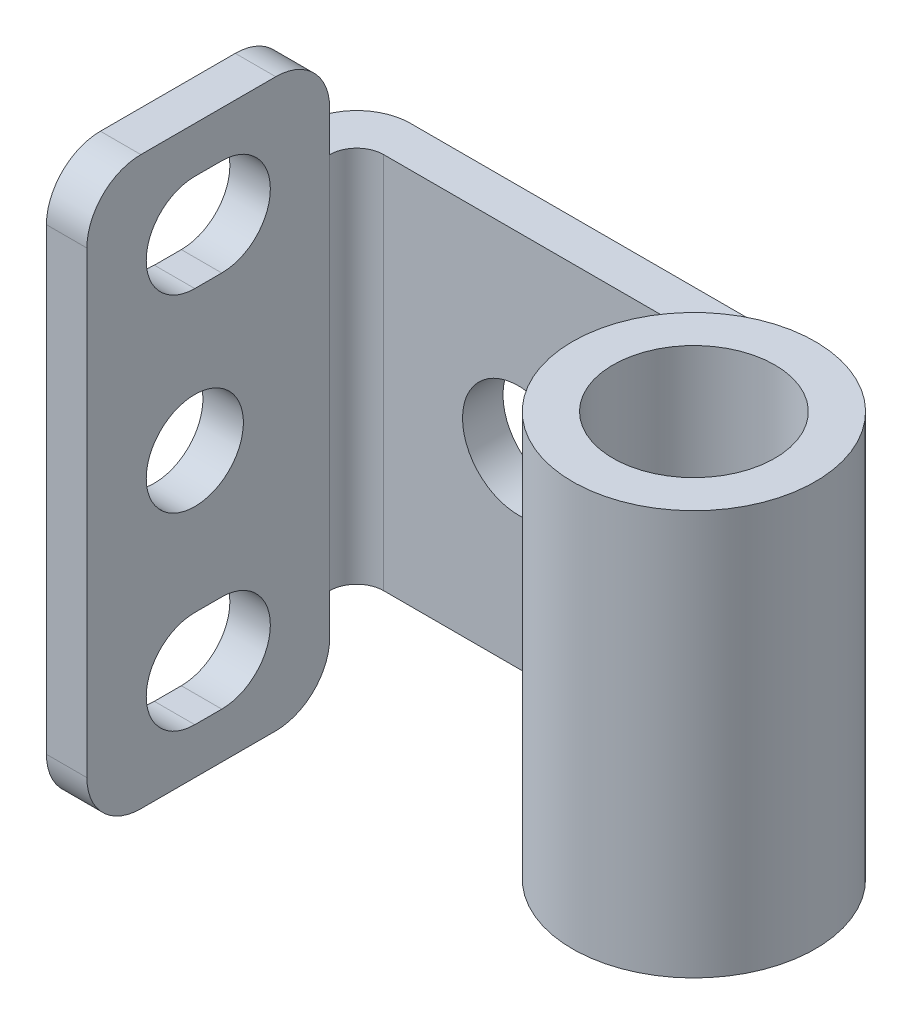
ISO-10303-21;
HEADER;
FILE_DESCRIPTION(('STEP AP214'),'2;1');
FILE_NAME('part.step','',(''),(''),'','','');
FILE_SCHEMA(('AUTOMOTIVE_DESIGN { 1 0 10303 214 1 1 1 1 }'));
ENDSEC;
DATA;
#1=APPLICATION_CONTEXT('core data for automotive mechanical design processes');
#2=APPLICATION_PROTOCOL_DEFINITION('international standard','automotive_design',2000,#1);
#3=PRODUCT_CONTEXT('',#1,'mechanical');
#4=PRODUCT('Part','Part','',(#3));
#5=PRODUCT_RELATED_PRODUCT_CATEGORY('part','',(#4));
#6=PRODUCT_DEFINITION_FORMATION('','',#4);
#7=PRODUCT_DEFINITION_CONTEXT('part definition',#1,'design');
#8=PRODUCT_DEFINITION('design','',#6,#7);
#9=PRODUCT_DEFINITION_SHAPE('','',#8);
#10=(LENGTH_UNIT() NAMED_UNIT(*) SI_UNIT(.MILLI.,.METRE.));
#11=(NAMED_UNIT(*) PLANE_ANGLE_UNIT() SI_UNIT($,.RADIAN.));
#12=(NAMED_UNIT(*) SI_UNIT($,.STERADIAN.) SOLID_ANGLE_UNIT());
#13=UNCERTAINTY_MEASURE_WITH_UNIT(LENGTH_MEASURE(1.E-05),#10,'distance_accuracy_value','');
#14=(GEOMETRIC_REPRESENTATION_CONTEXT(3) GLOBAL_UNCERTAINTY_ASSIGNED_CONTEXT((#13)) GLOBAL_UNIT_ASSIGNED_CONTEXT((#10,
#11,#12)) REPRESENTATION_CONTEXT('',''));
#15=CARTESIAN_POINT('',(0.,0.,0.));
#16=DIRECTION('',(0.,0.,1.));
#17=DIRECTION('',(1.,0.,0.));
#18=AXIS2_PLACEMENT_3D('',#15,#16,#17);
#19=CARTESIAN_POINT('',(0.,0.,-1.5));
#20=DIRECTION('',(0.,1.,0.));
#21=DIRECTION('',(0.,0.,1.));
#22=AXIS2_PLACEMENT_3D('',#19,#20,#21);
#23=PLANE('',#22);
#24=DIRECTION('',(-1.,0.,0.));
#25=VECTOR('',#24,1.);
#26=CARTESIAN_POINT('',(0.,0.,0.999999999999999));
#27=LINE('',#26,#25);
#28=CARTESIAN_POINT('',(0.,0.,0.999999999999999));
#29=VERTEX_POINT('',#28);
#30=CARTESIAN_POINT('',(-1.5,0.,0.999999999999999));
#31=VERTEX_POINT('',#30);
#32=EDGE_CURVE('E282',#29,#31,#27,.T.);
#33=ORIENTED_EDGE('',*,*,#32,.F.);
#34=CARTESIAN_POINT('',(1.,0.,1.));
#35=DIRECTION('',(0.,1.,0.));
#36=DIRECTION('',(0.,0.,1.));
#37=AXIS2_PLACEMENT_3D('',#34,#35,#36);
#38=CIRCLE('',#37,1.);
#39=CARTESIAN_POINT('',(1.,0.,0.));
#40=VERTEX_POINT('',#39);
#41=EDGE_CURVE('E365',#29,#40,#38,.F.);
#42=ORIENTED_EDGE('',*,*,#41,.T.);
#43=DIRECTION('',(-1.,0.,0.));
#44=VECTOR('',#43,1.);
#45=CARTESIAN_POINT('',(0.,0.,0.));
#46=LINE('',#45,#44);
#47=CARTESIAN_POINT('',(12.1458980337503,0.,0.));
#48=VERTEX_POINT('',#47);
#49=EDGE_CURVE('E340',#48,#40,#46,.T.);
#50=ORIENTED_EDGE('',*,*,#49,.F.);
#51=CARTESIAN_POINT('',(15.5,0.,3.));
#52=DIRECTION('',(0.,1.,0.));
#53=DIRECTION('',(0.,0.,1.));
#54=AXIS2_PLACEMENT_3D('',#51,#52,#53);
#55=CIRCLE('',#54,4.5);
#56=CARTESIAN_POINT('',(15.5,0.,-1.5));
#57=VERTEX_POINT('',#56);
#58=EDGE_CURVE('E327',#57,#48,#55,.T.);
#59=ORIENTED_EDGE('',*,*,#58,.F.);
#60=DIRECTION('',(-1.,0.,0.));
#61=VECTOR('',#60,1.);
#62=CARTESIAN_POINT('',(0.,0.,-1.5));
#63=LINE('',#62,#61);
#64=CARTESIAN_POINT('',(0.500000000000002,0.,-1.5));
#65=VERTEX_POINT('',#64);
#66=EDGE_CURVE('E339',#57,#65,#63,.T.);
#67=ORIENTED_EDGE('',*,*,#66,.T.);
#68=CARTESIAN_POINT('',(0.500000000000002,0.,0.5));
#69=DIRECTION('',(0.,1.,0.));
#70=DIRECTION('',(0.,0.,1.));
#71=AXIS2_PLACEMENT_3D('',#68,#69,#70);
#72=CIRCLE('',#71,2.);
#73=CARTESIAN_POINT('',(-1.5,0.,0.5));
#74=VERTEX_POINT('',#73);
#75=EDGE_CURVE('E349',#65,#74,#72,.T.);
#76=ORIENTED_EDGE('',*,*,#75,.T.);
#77=DIRECTION('',(0.,0.,-1.));
#78=VECTOR('',#77,1.);
#79=CARTESIAN_POINT('',(-1.5,0.,10.));
#80=LINE('',#79,#78);
#81=EDGE_CURVE('E309',#31,#74,#80,.T.);
#82=ORIENTED_EDGE('',*,*,#81,.F.);
#83=EDGE_LOOP('',(#33,#42,#50,#59,#67,#76,#82));
#84=FACE_BOUND('',#83,.T.);
#85=ADVANCED_FACE('F41',(#84),#23,.T.);
#86=CARTESIAN_POINT('',(0.,-14.,-1.5));
#87=DIRECTION('',(0.,-1.,0.));
#88=DIRECTION('',(0.,0.,-1.));
#89=AXIS2_PLACEMENT_3D('',#86,#87,#88);
#90=PLANE('',#89);
#91=DIRECTION('',(-1.,0.,0.));
#92=VECTOR('',#91,1.);
#93=CARTESIAN_POINT('',(0.,-14.,1.));
#94=LINE('',#93,#92);
#95=CARTESIAN_POINT('',(0.,-14.,0.999999999999999));
#96=VERTEX_POINT('',#95);
#97=CARTESIAN_POINT('',(-1.5,-14.,1.));
#98=VERTEX_POINT('',#97);
#99=EDGE_CURVE('E296',#96,#98,#94,.T.);
#100=ORIENTED_EDGE('',*,*,#99,.T.);
#101=DIRECTION('',(0.,0.,-1.));
#102=VECTOR('',#101,1.);
#103=CARTESIAN_POINT('',(-1.5,-14.,10.));
#104=LINE('',#103,#102);
#105=CARTESIAN_POINT('',(-1.5,-14.,0.5));
#106=VERTEX_POINT('',#105);
#107=EDGE_CURVE('E308',#98,#106,#104,.T.);
#108=ORIENTED_EDGE('',*,*,#107,.T.);
#109=CARTESIAN_POINT('',(0.500000000000002,-14.,0.5));
#110=DIRECTION('',(0.,-1.,0.));
#111=DIRECTION('',(0.,0.,-1.));
#112=AXIS2_PLACEMENT_3D('',#109,#110,#111);
#113=CIRCLE('',#112,2.);
#114=CARTESIAN_POINT('',(0.500000000000002,-14.,-1.5));
#115=VERTEX_POINT('',#114);
#116=EDGE_CURVE('E355',#106,#115,#113,.T.);
#117=ORIENTED_EDGE('',*,*,#116,.T.);
#118=DIRECTION('',(1.,0.,0.));
#119=VECTOR('',#118,1.);
#120=CARTESIAN_POINT('',(0.,-14.,-1.5));
#121=LINE('',#120,#119);
#122=CARTESIAN_POINT('',(15.5,-14.,-1.5));
#123=VERTEX_POINT('',#122);
#124=EDGE_CURVE('E337',#115,#123,#121,.T.);
#125=ORIENTED_EDGE('',*,*,#124,.T.);
#126=CARTESIAN_POINT('',(15.5,-14.,3.));
#127=DIRECTION('',(0.,-1.,0.));
#128=DIRECTION('',(0.,0.,-1.));
#129=AXIS2_PLACEMENT_3D('',#126,#127,#128);
#130=CIRCLE('',#129,4.5);
#131=CARTESIAN_POINT('',(12.1458980337503,-14.,0.));
#132=VERTEX_POINT('',#131);
#133=EDGE_CURVE('E322',#132,#123,#130,.T.);
#134=ORIENTED_EDGE('',*,*,#133,.F.);
#135=DIRECTION('',(1.,0.,0.));
#136=VECTOR('',#135,1.);
#137=CARTESIAN_POINT('',(0.,-14.,0.));
#138=LINE('',#137,#136);
#139=CARTESIAN_POINT('',(1.,-14.,0.));
#140=VERTEX_POINT('',#139);
#141=EDGE_CURVE('E336',#140,#132,#138,.T.);
#142=ORIENTED_EDGE('',*,*,#141,.F.);
#143=CARTESIAN_POINT('',(1.,-14.,1.));
#144=DIRECTION('',(0.,-1.,0.));
#145=DIRECTION('',(0.,0.,-1.));
#146=AXIS2_PLACEMENT_3D('',#143,#144,#145);
#147=CIRCLE('',#146,1.);
#148=EDGE_CURVE('E363',#140,#96,#147,.F.);
#149=ORIENTED_EDGE('',*,*,#148,.T.);
#150=EDGE_LOOP('',(#100,#108,#117,#125,#134,#142,#149));
#151=FACE_BOUND('',#150,.T.);
#152=ADVANCED_FACE('F455',(#151),#90,.T.);
#153=CARTESIAN_POINT('',(0.,0.,-1.5));
#154=DIRECTION('',(0.,0.,1.));
#155=DIRECTION('',(1.,0.,0.));
#156=AXIS2_PLACEMENT_3D('',#153,#154,#155);
#157=PLANE('',#156);
#158=CARTESIAN_POINT('',(6.,-7.,-1.5));
#159=DIRECTION('',(0.,0.,-1.));
#160=DIRECTION('',(-1.,0.,0.));
#161=AXIS2_PLACEMENT_3D('',#158,#159,#160);
#162=CIRCLE('',#161,2.07659019844144);
#163=CARTESIAN_POINT('',(3.92340980155857,-7.,-1.5));
#164=VERTEX_POINT('',#163);
#165=EDGE_CURVE('E223',#164,#164,#162,.T.);
#166=ORIENTED_EDGE('',*,*,#165,.F.);
#167=EDGE_LOOP('',(#166));
#168=FACE_BOUND('',#167,.T.);
#169=ORIENTED_EDGE('',*,*,#124,.F.);
#170=DIRECTION('',(0.,1.,0.));
#171=VECTOR('',#170,1.);
#172=CARTESIAN_POINT('',(0.500000000000002,0.,-1.5));
#173=LINE('',#172,#171);
#174=EDGE_CURVE('E343',#115,#65,#173,.T.);
#175=ORIENTED_EDGE('',*,*,#174,.T.);
#176=ORIENTED_EDGE('',*,*,#66,.F.);
#177=DIRECTION('',(0.,1.,0.));
#178=VECTOR('',#177,1.);
#179=CARTESIAN_POINT('',(15.5,0.,-1.5));
#180=LINE('',#179,#178);
#181=EDGE_CURVE('E333',#123,#57,#180,.T.);
#182=ORIENTED_EDGE('',*,*,#181,.F.);
#183=EDGE_LOOP('',(#169,#175,#176,#182));
#184=FACE_BOUND('',#183,.T.);
#185=ADVANCED_FACE('F459',(#168,#184),#157,.F.);
#186=CARTESIAN_POINT('',(0.,0.,0.));
#187=DIRECTION('',(0.,0.,1.));
#188=DIRECTION('',(1.,0.,0.));
#189=AXIS2_PLACEMENT_3D('',#186,#187,#188);
#190=PLANE('',#189);
#191=CARTESIAN_POINT('',(6.,-7.,0.));
#192=DIRECTION('',(0.,0.,-1.));
#193=DIRECTION('',(-1.,0.,0.));
#194=AXIS2_PLACEMENT_3D('',#191,#192,#193);
#195=CIRCLE('',#194,2.07659019844144);
#196=CARTESIAN_POINT('',(3.92340980155857,-7.,0.));
#197=VERTEX_POINT('',#196);
#198=EDGE_CURVE('E275',#197,#197,#195,.T.);
#199=ORIENTED_EDGE('',*,*,#198,.T.);
#200=EDGE_LOOP('',(#199));
#201=FACE_BOUND('',#200,.T.);
#202=ORIENTED_EDGE('',*,*,#49,.T.);
#203=DIRECTION('',(0.,-1.,0.));
#204=VECTOR('',#203,1.);
#205=CARTESIAN_POINT('',(1.,-14.,0.));
#206=LINE('',#205,#204);
#207=EDGE_CURVE('E357',#40,#140,#206,.T.);
#208=ORIENTED_EDGE('',*,*,#207,.T.);
#209=ORIENTED_EDGE('',*,*,#141,.T.);
#210=DIRECTION('',(0.,-1.,0.));
#211=VECTOR('',#210,1.);
#212=CARTESIAN_POINT('',(12.1458980337503,0.499999999999999,0.));
#213=LINE('',#212,#211);
#214=EDGE_CURVE('E330',#48,#132,#213,.T.);
#215=ORIENTED_EDGE('',*,*,#214,.F.);
#216=EDGE_LOOP('',(#202,#208,#209,#215));
#217=FACE_BOUND('',#216,.T.);
#218=ADVANCED_FACE('F466',(#201,#217),#190,.T.);
#219=CARTESIAN_POINT('',(15.5,0.499999999999999,3.));
#220=DIRECTION('',(0.,-1.,0.));
#221=DIRECTION('',(0.,0.,-1.));
#222=AXIS2_PLACEMENT_3D('',#219,#220,#221);
#223=CYLINDRICAL_SURFACE('',#222,4.5);
#224=ORIENTED_EDGE('',*,*,#58,.T.);
#225=ORIENTED_EDGE('',*,*,#214,.T.);
#226=ORIENTED_EDGE('',*,*,#133,.T.);
#227=ORIENTED_EDGE('',*,*,#181,.T.);
#228=EDGE_LOOP('',(#224,#225,#226,#227));
#229=FACE_BOUND('',#228,.T.);
#230=CARTESIAN_POINT('',(15.5,0.499999999999999,3.));
#231=DIRECTION('',(0.,-1.,0.));
#232=DIRECTION('',(-1.,0.,0.));
#233=AXIS2_PLACEMENT_3D('',#230,#231,#232);
#234=CIRCLE('',#233,4.5);
#235=CARTESIAN_POINT('',(11.,0.499999999999999,3.));
#236=VERTEX_POINT('',#235);
#237=EDGE_CURVE('E319',#236,#236,#234,.T.);
#238=ORIENTED_EDGE('',*,*,#237,.T.);
#239=EDGE_LOOP('',(#238));
#240=FACE_BOUND('',#239,.T.);
#241=CARTESIAN_POINT('',(15.5,-14.5,3.));
#242=DIRECTION('',(0.,-1.,0.));
#243=DIRECTION('',(-1.,0.,0.));
#244=AXIS2_PLACEMENT_3D('',#241,#242,#243);
#245=CIRCLE('',#244,4.5);
#246=CARTESIAN_POINT('',(11.,-14.5,3.));
#247=VERTEX_POINT('',#246);
#248=EDGE_CURVE('E316',#247,#247,#245,.T.);
#249=ORIENTED_EDGE('',*,*,#248,.F.);
#250=EDGE_LOOP('',(#249));
#251=FACE_BOUND('',#250,.T.);
#252=ADVANCED_FACE('F462',(#229,#240,#251),#223,.T.);
#253=CARTESIAN_POINT('',(15.5,0.499999999999999,3.));
#254=DIRECTION('',(0.,-1.,0.));
#255=DIRECTION('',(0.,0.,-1.));
#256=AXIS2_PLACEMENT_3D('',#253,#254,#255);
#257=PLANE('',#256);
#258=CARTESIAN_POINT('',(15.5,0.499999999999999,3.));
#259=DIRECTION('',(0.,-1.,0.));
#260=DIRECTION('',(0.,0.,-1.));
#261=AXIS2_PLACEMENT_3D('',#258,#259,#260);
#262=CIRCLE('',#261,3.);
#263=CARTESIAN_POINT('',(15.5,0.499999999999999,0.));
#264=VERTEX_POINT('',#263);
#265=EDGE_CURVE('E313',#264,#264,#262,.T.);
#266=ORIENTED_EDGE('',*,*,#265,.T.);
#267=EDGE_LOOP('',(#266));
#268=FACE_BOUND('',#267,.T.);
#269=ORIENTED_EDGE('',*,*,#237,.F.);
#270=EDGE_LOOP('',(#269));
#271=FACE_BOUND('',#270,.T.);
#272=ADVANCED_FACE('F494',(#268,#271),#257,.F.);
#273=CARTESIAN_POINT('',(15.5,-14.5,3.));
#274=DIRECTION('',(0.,-1.,0.));
#275=DIRECTION('',(0.,0.,-1.));
#276=AXIS2_PLACEMENT_3D('',#273,#274,#275);
#277=PLANE('',#276);
#278=CARTESIAN_POINT('',(15.5,-14.5,3.));
#279=DIRECTION('',(0.,-1.,0.));
#280=DIRECTION('',(0.,0.,-1.));
#281=AXIS2_PLACEMENT_3D('',#278,#279,#280);
#282=CIRCLE('',#281,3.);
#283=CARTESIAN_POINT('',(15.5,-14.5,0.));
#284=VERTEX_POINT('',#283);
#285=EDGE_CURVE('E311',#284,#284,#282,.T.);
#286=ORIENTED_EDGE('',*,*,#285,.F.);
#287=EDGE_LOOP('',(#286));
#288=FACE_BOUND('',#287,.T.);
#289=ORIENTED_EDGE('',*,*,#248,.T.);
#290=EDGE_LOOP('',(#289));
#291=FACE_BOUND('',#290,.T.);
#292=ADVANCED_FACE('F495',(#288,#291),#277,.T.);
#293=CARTESIAN_POINT('',(15.5,0.499999999999999,3.));
#294=DIRECTION('',(0.,-1.,0.));
#295=DIRECTION('',(0.,0.,-1.));
#296=AXIS2_PLACEMENT_3D('',#293,#294,#295);
#297=CYLINDRICAL_SURFACE('',#296,3.);
#298=ORIENTED_EDGE('',*,*,#265,.F.);
#299=EDGE_LOOP('',(#298));
#300=FACE_BOUND('',#299,.T.);
#301=ORIENTED_EDGE('',*,*,#285,.T.);
#302=EDGE_LOOP('',(#301));
#303=FACE_BOUND('',#302,.T.);
#304=ADVANCED_FACE('F498',(#300,#303),#297,.F.);
#305=CARTESIAN_POINT('',(0.,-14.,10.));
#306=DIRECTION('',(1.,0.,0.));
#307=DIRECTION('',(0.,1.,0.));
#308=AXIS2_PLACEMENT_3D('',#305,#306,#307);
#309=PLANE('',#308);
#310=CARTESIAN_POINT('',(0.,0.,5.));
#311=DIRECTION('',(-1.,0.,0.));
#312=DIRECTION('',(0.,0.,1.));
#313=AXIS2_PLACEMENT_3D('',#310,#311,#312);
#314=CIRCLE('',#313,1.8);
#315=CARTESIAN_POINT('',(0.,1.8,5.));
#316=VERTEX_POINT('',#315);
#317=CARTESIAN_POINT('',(0.,-1.8,5.));
#318=VERTEX_POINT('',#317);
#319=EDGE_CURVE('E199',#316,#318,#314,.T.);
#320=ORIENTED_EDGE('',*,*,#319,.T.);
#321=DIRECTION('',(0.,0.,1.));
#322=VECTOR('',#321,1.);
#323=CARTESIAN_POINT('',(0.,-1.8,5.));
#324=LINE('',#323,#322);
#325=CARTESIAN_POINT('',(0.,-1.8,6.));
#326=VERTEX_POINT('',#325);
#327=EDGE_CURVE('E210',#318,#326,#324,.T.);
#328=ORIENTED_EDGE('',*,*,#327,.T.);
#329=CARTESIAN_POINT('',(0.,0.,6.));
#330=DIRECTION('',(-1.,0.,0.));
#331=DIRECTION('',(0.,0.,1.));
#332=AXIS2_PLACEMENT_3D('',#329,#330,#331);
#333=CIRCLE('',#332,1.8);
#334=CARTESIAN_POINT('',(0.,1.8,6.));
#335=VERTEX_POINT('',#334);
#336=EDGE_CURVE('E56',#326,#335,#333,.T.);
#337=ORIENTED_EDGE('',*,*,#336,.T.);
#338=DIRECTION('',(0.,0.,-1.));
#339=VECTOR('',#338,1.);
#340=CARTESIAN_POINT('',(0.,1.8,5.));
#341=LINE('',#340,#339);
#342=EDGE_CURVE('E207',#335,#316,#341,.T.);
#343=ORIENTED_EDGE('',*,*,#342,.T.);
#344=EDGE_LOOP('',(#320,#328,#337,#343));
#345=FACE_BOUND('',#344,.T.);
#346=CARTESIAN_POINT('',(0.,-14.,5.));
#347=DIRECTION('',(-1.,0.,0.));
#348=DIRECTION('',(0.,0.,-1.));
#349=AXIS2_PLACEMENT_3D('',#346,#347,#348);
#350=CIRCLE('',#349,1.8);
#351=CARTESIAN_POINT('',(0.,-12.2,5.));
#352=VERTEX_POINT('',#351);
#353=CARTESIAN_POINT('',(0.,-15.8,5.));
#354=VERTEX_POINT('',#353);
#355=EDGE_CURVE('E240',#352,#354,#350,.T.);
#356=ORIENTED_EDGE('',*,*,#355,.T.);
#357=DIRECTION('',(0.,0.,1.));
#358=VECTOR('',#357,1.);
#359=CARTESIAN_POINT('',(0.,-15.8,5.));
#360=LINE('',#359,#358);
#361=CARTESIAN_POINT('',(0.,-15.8,6.));
#362=VERTEX_POINT('',#361);
#363=EDGE_CURVE('E243',#354,#362,#360,.T.);
#364=ORIENTED_EDGE('',*,*,#363,.T.);
#365=CARTESIAN_POINT('',(0.,-14.,6.));
#366=DIRECTION('',(-1.,0.,0.));
#367=DIRECTION('',(0.,0.,-1.));
#368=AXIS2_PLACEMENT_3D('',#365,#366,#367);
#369=CIRCLE('',#368,1.8);
#370=CARTESIAN_POINT('',(0.,-12.2,6.));
#371=VERTEX_POINT('',#370);
#372=EDGE_CURVE('E64',#362,#371,#369,.T.);
#373=ORIENTED_EDGE('',*,*,#372,.T.);
#374=DIRECTION('',(0.,0.,-1.));
#375=VECTOR('',#374,1.);
#376=CARTESIAN_POINT('',(0.,-12.2,5.));
#377=LINE('',#376,#375);
#378=EDGE_CURVE('E248',#371,#352,#377,.T.);
#379=ORIENTED_EDGE('',*,*,#378,.T.);
#380=EDGE_LOOP('',(#356,#364,#373,#379));
#381=FACE_BOUND('',#380,.T.);
#382=CARTESIAN_POINT('',(0.,-7.,6.));
#383=DIRECTION('',(-1.,0.,0.));
#384=DIRECTION('',(0.,0.,1.));
#385=AXIS2_PLACEMENT_3D('',#382,#383,#384);
#386=CIRCLE('',#385,1.8);
#387=CARTESIAN_POINT('',(0.,-7.,7.8));
#388=VERTEX_POINT('',#387);
#389=EDGE_CURVE('E255',#388,#388,#386,.T.);
#390=ORIENTED_EDGE('',*,*,#389,.T.);
#391=EDGE_LOOP('',(#390));
#392=FACE_BOUND('',#391,.T.);
#393=DIRECTION('',(0.,0.,-1.));
#394=VECTOR('',#393,1.);
#395=CARTESIAN_POINT('',(0.,3.5,10.));
#396=LINE('',#395,#394);
#397=CARTESIAN_POINT('',(0.,3.5,8.));
#398=VERTEX_POINT('',#397);
#399=CARTESIAN_POINT('',(0.,3.5,3.));
#400=VERTEX_POINT('',#399);
#401=EDGE_CURVE('E276',#398,#400,#396,.T.);
#402=ORIENTED_EDGE('',*,*,#401,.F.);
#403=CARTESIAN_POINT('',(0.,1.5,8.));
#404=DIRECTION('',(1.,0.,0.));
#405=DIRECTION('',(0.,1.,0.));
#406=AXIS2_PLACEMENT_3D('',#403,#404,#405);
#407=CIRCLE('',#406,2.);
#408=CARTESIAN_POINT('',(0.,1.5,10.));
#409=VERTEX_POINT('',#408);
#410=EDGE_CURVE('E391',#398,#409,#407,.T.);
#411=ORIENTED_EDGE('',*,*,#410,.T.);
#412=DIRECTION('',(0.,-1.,0.));
#413=VECTOR('',#412,1.);
#414=CARTESIAN_POINT('',(0.,-14.,10.));
#415=LINE('',#414,#413);
#416=CARTESIAN_POINT('',(0.,-15.5,10.));
#417=VERTEX_POINT('',#416);
#418=EDGE_CURVE('E302',#409,#417,#415,.T.);
#419=ORIENTED_EDGE('',*,*,#418,.T.);
#420=CARTESIAN_POINT('',(0.,-15.5,8.));
#421=DIRECTION('',(1.,0.,0.));
#422=DIRECTION('',(0.,1.,0.));
#423=AXIS2_PLACEMENT_3D('',#420,#421,#422);
#424=CIRCLE('',#423,2.);
#425=CARTESIAN_POINT('',(0.,-17.5,8.));
#426=VERTEX_POINT('',#425);
#427=EDGE_CURVE('E385',#417,#426,#424,.T.);
#428=ORIENTED_EDGE('',*,*,#427,.T.);
#429=DIRECTION('',(0.,0.,1.));
#430=VECTOR('',#429,1.);
#431=CARTESIAN_POINT('',(0.,-17.5,10.));
#432=LINE('',#431,#430);
#433=CARTESIAN_POINT('',(0.,-17.5,3.));
#434=VERTEX_POINT('',#433);
#435=EDGE_CURVE('E292',#434,#426,#432,.T.);
#436=ORIENTED_EDGE('',*,*,#435,.F.);
#437=CARTESIAN_POINT('',(0.,-15.5,3.));
#438=DIRECTION('',(1.,0.,0.));
#439=DIRECTION('',(0.,1.,0.));
#440=AXIS2_PLACEMENT_3D('',#437,#438,#439);
#441=CIRCLE('',#440,2.);
#442=CARTESIAN_POINT('',(0.,-15.5,1.));
#443=VERTEX_POINT('',#442);
#444=EDGE_CURVE('E387',#434,#443,#441,.T.);
#445=ORIENTED_EDGE('',*,*,#444,.T.);
#446=DIRECTION('',(0.,-1.,0.));
#447=VECTOR('',#446,1.);
#448=CARTESIAN_POINT('',(0.,-14.,1.));
#449=LINE('',#448,#447);
#450=EDGE_CURVE('E289',#96,#443,#449,.T.);
#451=ORIENTED_EDGE('',*,*,#450,.F.);
#452=DIRECTION('',(0.,-1.,0.));
#453=VECTOR('',#452,1.);
#454=CARTESIAN_POINT('',(0.,0.,1.));
#455=LINE('',#454,#453);
#456=EDGE_CURVE('E360',#96,#29,#455,.F.);
#457=ORIENTED_EDGE('',*,*,#456,.T.);
#458=DIRECTION('',(0.,-1.,0.));
#459=VECTOR('',#458,1.);
#460=CARTESIAN_POINT('',(0.,0.,0.999999999999999));
#461=LINE('',#460,#459);
#462=CARTESIAN_POINT('',(0.,1.5,1.));
#463=VERTEX_POINT('',#462);
#464=EDGE_CURVE('E279',#463,#29,#461,.T.);
#465=ORIENTED_EDGE('',*,*,#464,.F.);
#466=CARTESIAN_POINT('',(0.,1.5,3.));
#467=DIRECTION('',(1.,0.,0.));
#468=DIRECTION('',(0.,1.,0.));
#469=AXIS2_PLACEMENT_3D('',#466,#467,#468);
#470=CIRCLE('',#469,2.);
#471=EDGE_CURVE('E389',#463,#400,#470,.T.);
#472=ORIENTED_EDGE('',*,*,#471,.T.);
#473=EDGE_LOOP('',(#402,#411,#419,#428,#436,#445,#451,#457,#465,#472));
#474=FACE_BOUND('',#473,.T.);
#475=ADVANCED_FACE('F214',(#345,#381,#392,#474),#309,.T.);
#476=CARTESIAN_POINT('',(-1.5,-14.,10.));
#477=DIRECTION('',(-1.,0.,0.));
#478=DIRECTION('',(0.,0.,1.));
#479=AXIS2_PLACEMENT_3D('',#476,#477,#478);
#480=PLANE('',#479);
#481=CARTESIAN_POINT('',(-1.5,0.,5.));
#482=DIRECTION('',(-1.,0.,0.));
#483=DIRECTION('',(0.,0.,1.));
#484=AXIS2_PLACEMENT_3D('',#481,#482,#483);
#485=CIRCLE('',#484,1.8);
#486=CARTESIAN_POINT('',(-1.5,1.8,5.));
#487=VERTEX_POINT('',#486);
#488=CARTESIAN_POINT('',(-1.5,-1.8,5.));
#489=VERTEX_POINT('',#488);
#490=EDGE_CURVE('E202',#487,#489,#485,.T.);
#491=ORIENTED_EDGE('',*,*,#490,.F.);
#492=DIRECTION('',(0.,0.,-1.));
#493=VECTOR('',#492,1.);
#494=CARTESIAN_POINT('',(-1.5,1.8,5.));
#495=LINE('',#494,#493);
#496=CARTESIAN_POINT('',(-1.5,1.8,6.));
#497=VERTEX_POINT('',#496);
#498=EDGE_CURVE('E217',#497,#487,#495,.T.);
#499=ORIENTED_EDGE('',*,*,#498,.F.);
#500=CARTESIAN_POINT('',(-1.5,0.,6.));
#501=DIRECTION('',(-1.,0.,0.));
#502=DIRECTION('',(0.,0.,1.));
#503=AXIS2_PLACEMENT_3D('',#500,#501,#502);
#504=CIRCLE('',#503,1.8);
#505=CARTESIAN_POINT('',(-1.5,-1.8,6.));
#506=VERTEX_POINT('',#505);
#507=EDGE_CURVE('E220',#506,#497,#504,.T.);
#508=ORIENTED_EDGE('',*,*,#507,.F.);
#509=DIRECTION('',(0.,0.,1.));
#510=VECTOR('',#509,1.);
#511=CARTESIAN_POINT('',(-1.5,-1.8,5.));
#512=LINE('',#511,#510);
#513=EDGE_CURVE('E229',#489,#506,#512,.T.);
#514=ORIENTED_EDGE('',*,*,#513,.F.);
#515=EDGE_LOOP('',(#491,#499,#508,#514));
#516=FACE_BOUND('',#515,.T.);
#517=CARTESIAN_POINT('',(-1.5,-14.,5.));
#518=DIRECTION('',(-1.,0.,0.));
#519=DIRECTION('',(0.,0.,-1.));
#520=AXIS2_PLACEMENT_3D('',#517,#518,#519);
#521=CIRCLE('',#520,1.8);
#522=CARTESIAN_POINT('',(-1.5,-12.2,5.));
#523=VERTEX_POINT('',#522);
#524=CARTESIAN_POINT('',(-1.5,-15.8,5.));
#525=VERTEX_POINT('',#524);
#526=EDGE_CURVE('E252',#523,#525,#521,.T.);
#527=ORIENTED_EDGE('',*,*,#526,.F.);
#528=DIRECTION('',(0.,0.,-1.));
#529=VECTOR('',#528,1.);
#530=CARTESIAN_POINT('',(-1.5,-12.2,5.));
#531=LINE('',#530,#529);
#532=CARTESIAN_POINT('',(-1.5,-12.2,6.));
#533=VERTEX_POINT('',#532);
#534=EDGE_CURVE('E244',#533,#523,#531,.T.);
#535=ORIENTED_EDGE('',*,*,#534,.F.);
#536=CARTESIAN_POINT('',(-1.5,-14.,6.));
#537=DIRECTION('',(-1.,0.,0.));
#538=DIRECTION('',(0.,0.,-1.));
#539=AXIS2_PLACEMENT_3D('',#536,#537,#538);
#540=CIRCLE('',#539,1.8);
#541=CARTESIAN_POINT('',(-1.5,-15.8,6.));
#542=VERTEX_POINT('',#541);
#543=EDGE_CURVE('E258',#542,#533,#540,.T.);
#544=ORIENTED_EDGE('',*,*,#543,.F.);
#545=DIRECTION('',(0.,0.,1.));
#546=VECTOR('',#545,1.);
#547=CARTESIAN_POINT('',(-1.5,-15.8,5.));
#548=LINE('',#547,#546);
#549=EDGE_CURVE('E254',#525,#542,#548,.T.);
#550=ORIENTED_EDGE('',*,*,#549,.F.);
#551=EDGE_LOOP('',(#527,#535,#544,#550));
#552=FACE_BOUND('',#551,.T.);
#553=CARTESIAN_POINT('',(-1.5,-7.,6.));
#554=DIRECTION('',(-1.,0.,0.));
#555=DIRECTION('',(0.,0.,1.));
#556=AXIS2_PLACEMENT_3D('',#553,#554,#555);
#557=CIRCLE('',#556,1.8);
#558=CARTESIAN_POINT('',(-1.5,-7.,7.8));
#559=VERTEX_POINT('',#558);
#560=EDGE_CURVE('E272',#559,#559,#557,.T.);
#561=ORIENTED_EDGE('',*,*,#560,.F.);
#562=EDGE_LOOP('',(#561));
#563=FACE_BOUND('',#562,.T.);
#564=DIRECTION('',(0.,1.,0.));
#565=VECTOR('',#564,1.);
#566=CARTESIAN_POINT('',(-1.5,-14.,10.));
#567=LINE('',#566,#565);
#568=CARTESIAN_POINT('',(-1.5,-15.5,10.));
#569=VERTEX_POINT('',#568);
#570=CARTESIAN_POINT('',(-1.5,1.5,10.));
#571=VERTEX_POINT('',#570);
#572=EDGE_CURVE('E305',#569,#571,#567,.T.);
#573=ORIENTED_EDGE('',*,*,#572,.T.);
#574=CARTESIAN_POINT('',(-1.5,1.5,8.));
#575=DIRECTION('',(-1.,0.,0.));
#576=DIRECTION('',(0.,0.,1.));
#577=AXIS2_PLACEMENT_3D('',#574,#575,#576);
#578=CIRCLE('',#577,2.);
#579=CARTESIAN_POINT('',(-1.5,3.5,8.));
#580=VERTEX_POINT('',#579);
#581=EDGE_CURVE('E378',#571,#580,#578,.T.);
#582=ORIENTED_EDGE('',*,*,#581,.T.);
#583=DIRECTION('',(0.,0.,-1.));
#584=VECTOR('',#583,1.);
#585=CARTESIAN_POINT('',(-1.5,3.5,10.));
#586=LINE('',#585,#584);
#587=CARTESIAN_POINT('',(-1.5,3.5,3.));
#588=VERTEX_POINT('',#587);
#589=EDGE_CURVE('E236',#580,#588,#586,.T.);
#590=ORIENTED_EDGE('',*,*,#589,.T.);
#591=CARTESIAN_POINT('',(-1.5,1.5,3.));
#592=DIRECTION('',(-1.,0.,0.));
#593=DIRECTION('',(0.,0.,1.));
#594=AXIS2_PLACEMENT_3D('',#591,#592,#593);
#595=CIRCLE('',#594,2.);
#596=CARTESIAN_POINT('',(-1.5,1.5,1.));
#597=VERTEX_POINT('',#596);
#598=EDGE_CURVE('E376',#588,#597,#595,.T.);
#599=ORIENTED_EDGE('',*,*,#598,.T.);
#600=DIRECTION('',(0.,-1.,0.));
#601=VECTOR('',#600,1.);
#602=CARTESIAN_POINT('',(-1.5,0.,0.999999999999999));
#603=LINE('',#602,#601);
#604=EDGE_CURVE('E280',#597,#31,#603,.T.);
#605=ORIENTED_EDGE('',*,*,#604,.T.);
#606=ORIENTED_EDGE('',*,*,#81,.T.);
#607=DIRECTION('',(0.,1.,0.));
#608=VECTOR('',#607,1.);
#609=CARTESIAN_POINT('',(-1.5,-14.,0.5));
#610=LINE('',#609,#608);
#611=EDGE_CURVE('E352',#74,#106,#610,.F.);
#612=ORIENTED_EDGE('',*,*,#611,.T.);
#613=ORIENTED_EDGE('',*,*,#107,.F.);
#614=DIRECTION('',(0.,-1.,0.));
#615=VECTOR('',#614,1.);
#616=CARTESIAN_POINT('',(-1.5,-14.,1.));
#617=LINE('',#616,#615);
#618=CARTESIAN_POINT('',(-1.5,-15.5,1.));
#619=VERTEX_POINT('',#618);
#620=EDGE_CURVE('E288',#98,#619,#617,.T.);
#621=ORIENTED_EDGE('',*,*,#620,.T.);
#622=CARTESIAN_POINT('',(-1.5,-15.5,3.));
#623=DIRECTION('',(-1.,0.,0.));
#624=DIRECTION('',(0.,0.,1.));
#625=AXIS2_PLACEMENT_3D('',#622,#623,#624);
#626=CIRCLE('',#625,2.);
#627=CARTESIAN_POINT('',(-1.5,-17.5,3.));
#628=VERTEX_POINT('',#627);
#629=EDGE_CURVE('E374',#619,#628,#626,.T.);
#630=ORIENTED_EDGE('',*,*,#629,.T.);
#631=DIRECTION('',(0.,0.,1.));
#632=VECTOR('',#631,1.);
#633=CARTESIAN_POINT('',(-1.5,-17.5,10.));
#634=LINE('',#633,#632);
#635=CARTESIAN_POINT('',(-1.5,-17.5,8.));
#636=VERTEX_POINT('',#635);
#637=EDGE_CURVE('E293',#628,#636,#634,.T.);
#638=ORIENTED_EDGE('',*,*,#637,.T.);
#639=CARTESIAN_POINT('',(-1.5,-15.5,8.));
#640=DIRECTION('',(-1.,0.,0.));
#641=DIRECTION('',(0.,0.,1.));
#642=AXIS2_PLACEMENT_3D('',#639,#640,#641);
#643=CIRCLE('',#642,2.);
#644=EDGE_CURVE('E372',#636,#569,#643,.T.);
#645=ORIENTED_EDGE('',*,*,#644,.T.);
#646=EDGE_LOOP('',(#573,#582,#590,#599,#605,#606,#612,#613,#621,#630,#638,#645));
#647=FACE_BOUND('',#646,.T.);
#648=ADVANCED_FACE('F407',(#516,#552,#563,#647),#480,.T.);
#649=CARTESIAN_POINT('',(0.,0.,10.));
#650=DIRECTION('',(0.,0.,1.));
#651=DIRECTION('',(1.,0.,0.));
#652=AXIS2_PLACEMENT_3D('',#649,#650,#651);
#653=PLANE('',#652);
#654=ORIENTED_EDGE('',*,*,#418,.F.);
#655=DIRECTION('',(-1.,0.,0.));
#656=VECTOR('',#655,1.);
#657=CARTESIAN_POINT('',(0.,1.5,10.));
#658=LINE('',#657,#656);
#659=EDGE_CURVE('E369',#409,#571,#658,.T.);
#660=ORIENTED_EDGE('',*,*,#659,.T.);
#661=ORIENTED_EDGE('',*,*,#572,.F.);
#662=DIRECTION('',(-1.,0.,0.));
#663=VECTOR('',#662,1.);
#664=CARTESIAN_POINT('',(0.,-15.5,10.));
#665=LINE('',#664,#663);
#666=EDGE_CURVE('E367',#569,#417,#665,.F.);
#667=ORIENTED_EDGE('',*,*,#666,.T.);
#668=EDGE_LOOP('',(#654,#660,#661,#667));
#669=FACE_BOUND('',#668,.T.);
#670=ADVANCED_FACE('F427',(#669),#653,.T.);
#671=CARTESIAN_POINT('',(0.500000000000002,0.,0.5));
#672=DIRECTION('',(0.,-1.,0.));
#673=DIRECTION('',(0.,0.,-1.));
#674=AXIS2_PLACEMENT_3D('',#671,#672,#673);
#675=CYLINDRICAL_SURFACE('',#674,2.);
#676=ORIENTED_EDGE('',*,*,#116,.F.);
#677=ORIENTED_EDGE('',*,*,#611,.F.);
#678=ORIENTED_EDGE('',*,*,#75,.F.);
#679=ORIENTED_EDGE('',*,*,#174,.F.);
#680=EDGE_LOOP('',(#676,#677,#678,#679));
#681=FACE_BOUND('',#680,.T.);
#682=ADVANCED_FACE('F452',(#681),#675,.T.);
#683=CARTESIAN_POINT('',(1.,0.,1.));
#684=DIRECTION('',(0.,1.,0.));
#685=DIRECTION('',(-1.,0.,0.));
#686=AXIS2_PLACEMENT_3D('',#683,#684,#685);
#687=CYLINDRICAL_SURFACE('',#686,1.);
#688=ORIENTED_EDGE('',*,*,#41,.F.);
#689=ORIENTED_EDGE('',*,*,#456,.F.);
#690=ORIENTED_EDGE('',*,*,#148,.F.);
#691=ORIENTED_EDGE('',*,*,#207,.F.);
#692=EDGE_LOOP('',(#688,#689,#690,#691));
#693=FACE_BOUND('',#692,.T.);
#694=ADVANCED_FACE('F469',(#693),#687,.F.);
#695=CARTESIAN_POINT('',(0.,-17.5,10.));
#696=DIRECTION('',(0.,-1.,0.));
#697=DIRECTION('',(0.,0.,-1.));
#698=AXIS2_PLACEMENT_3D('',#695,#696,#697);
#699=PLANE('',#698);
#700=ORIENTED_EDGE('',*,*,#637,.F.);
#701=DIRECTION('',(-1.,0.,0.));
#702=VECTOR('',#701,1.);
#703=CARTESIAN_POINT('',(0.,-17.5,3.));
#704=LINE('',#703,#702);
#705=EDGE_CURVE('E12',#628,#434,#704,.F.);
#706=ORIENTED_EDGE('',*,*,#705,.T.);
#707=ORIENTED_EDGE('',*,*,#435,.T.);
#708=DIRECTION('',(-1.,0.,0.));
#709=VECTOR('',#708,1.);
#710=CARTESIAN_POINT('',(0.,-17.5,8.));
#711=LINE('',#710,#709);
#712=EDGE_CURVE('E49',#426,#636,#711,.T.);
#713=ORIENTED_EDGE('',*,*,#712,.T.);
#714=EDGE_LOOP('',(#700,#706,#707,#713));
#715=FACE_BOUND('',#714,.T.);
#716=ADVANCED_FACE('F401',(#715),#699,.T.);
#717=CARTESIAN_POINT('',(0.,-14.,1.));
#718=DIRECTION('',(0.,0.,-1.));
#719=DIRECTION('',(-1.,0.,0.));
#720=AXIS2_PLACEMENT_3D('',#717,#718,#719);
#721=PLANE('',#720);
#722=ORIENTED_EDGE('',*,*,#450,.T.);
#723=DIRECTION('',(-1.,0.,0.));
#724=VECTOR('',#723,1.);
#725=CARTESIAN_POINT('',(0.,-15.5,1.));
#726=LINE('',#725,#724);
#727=EDGE_CURVE('E395',#443,#619,#726,.T.);
#728=ORIENTED_EDGE('',*,*,#727,.T.);
#729=ORIENTED_EDGE('',*,*,#620,.F.);
#730=ORIENTED_EDGE('',*,*,#99,.F.);
#731=EDGE_LOOP('',(#722,#728,#729,#730));
#732=FACE_BOUND('',#731,.T.);
#733=ADVANCED_FACE('F416',(#732),#721,.T.);
#734=CARTESIAN_POINT('',(0.,0.,0.999999999999999));
#735=DIRECTION('',(0.,0.,-1.));
#736=DIRECTION('',(0.,1.,0.));
#737=AXIS2_PLACEMENT_3D('',#734,#735,#736);
#738=PLANE('',#737);
#739=ORIENTED_EDGE('',*,*,#604,.F.);
#740=DIRECTION('',(-1.,0.,0.));
#741=VECTOR('',#740,1.);
#742=CARTESIAN_POINT('',(0.,1.5,1.));
#743=LINE('',#742,#741);
#744=EDGE_CURVE('E393',#597,#463,#743,.F.);
#745=ORIENTED_EDGE('',*,*,#744,.T.);
#746=ORIENTED_EDGE('',*,*,#464,.T.);
#747=ORIENTED_EDGE('',*,*,#32,.T.);
#748=EDGE_LOOP('',(#739,#745,#746,#747));
#749=FACE_BOUND('',#748,.T.);
#750=ADVANCED_FACE('F444',(#749),#738,.T.);
#751=CARTESIAN_POINT('',(0.,3.5,10.));
#752=DIRECTION('',(0.,1.,0.));
#753=DIRECTION('',(0.,0.,1.));
#754=AXIS2_PLACEMENT_3D('',#751,#752,#753);
#755=PLANE('',#754);
#756=ORIENTED_EDGE('',*,*,#589,.F.);
#757=DIRECTION('',(-1.,0.,0.));
#758=VECTOR('',#757,1.);
#759=CARTESIAN_POINT('',(0.,3.5,8.));
#760=LINE('',#759,#758);
#761=EDGE_CURVE('E383',#580,#398,#760,.F.);
#762=ORIENTED_EDGE('',*,*,#761,.T.);
#763=ORIENTED_EDGE('',*,*,#401,.T.);
#764=DIRECTION('',(-1.,0.,0.));
#765=VECTOR('',#764,1.);
#766=CARTESIAN_POINT('',(0.,3.5,3.));
#767=LINE('',#766,#765);
#768=EDGE_CURVE('E380',#400,#588,#767,.T.);
#769=ORIENTED_EDGE('',*,*,#768,.T.);
#770=EDGE_LOOP('',(#756,#762,#763,#769));
#771=FACE_BOUND('',#770,.T.);
#772=ADVANCED_FACE('F433',(#771),#755,.T.);
#773=CARTESIAN_POINT('',(0.,1.5,8.));
#774=DIRECTION('',(-1.,0.,0.));
#775=DIRECTION('',(0.,0.,1.));
#776=AXIS2_PLACEMENT_3D('',#773,#774,#775);
#777=CYLINDRICAL_SURFACE('',#776,2.);
#778=ORIENTED_EDGE('',*,*,#410,.F.);
#779=ORIENTED_EDGE('',*,*,#761,.F.);
#780=ORIENTED_EDGE('',*,*,#581,.F.);
#781=ORIENTED_EDGE('',*,*,#659,.F.);
#782=EDGE_LOOP('',(#778,#779,#780,#781));
#783=FACE_BOUND('',#782,.T.);
#784=ADVANCED_FACE('F436',(#783),#777,.T.);
#785=CARTESIAN_POINT('',(0.,1.5,3.));
#786=DIRECTION('',(-1.,0.,0.));
#787=DIRECTION('',(0.,0.,1.));
#788=AXIS2_PLACEMENT_3D('',#785,#786,#787);
#789=CYLINDRICAL_SURFACE('',#788,2.);
#790=ORIENTED_EDGE('',*,*,#471,.F.);
#791=ORIENTED_EDGE('',*,*,#744,.F.);
#792=ORIENTED_EDGE('',*,*,#598,.F.);
#793=ORIENTED_EDGE('',*,*,#768,.F.);
#794=EDGE_LOOP('',(#790,#791,#792,#793));
#795=FACE_BOUND('',#794,.T.);
#796=ADVANCED_FACE('F439',(#795),#789,.T.);
#797=CARTESIAN_POINT('',(0.,-15.5,3.));
#798=DIRECTION('',(-1.,0.,0.));
#799=DIRECTION('',(0.,0.,1.));
#800=AXIS2_PLACEMENT_3D('',#797,#798,#799);
#801=CYLINDRICAL_SURFACE('',#800,2.);
#802=ORIENTED_EDGE('',*,*,#444,.F.);
#803=ORIENTED_EDGE('',*,*,#705,.F.);
#804=ORIENTED_EDGE('',*,*,#629,.F.);
#805=ORIENTED_EDGE('',*,*,#727,.F.);
#806=EDGE_LOOP('',(#802,#803,#804,#805));
#807=FACE_BOUND('',#806,.T.);
#808=ADVANCED_FACE('F414',(#807),#801,.T.);
#809=CARTESIAN_POINT('',(0.,-15.5,8.));
#810=DIRECTION('',(-1.,0.,0.));
#811=DIRECTION('',(0.,0.,1.));
#812=AXIS2_PLACEMENT_3D('',#809,#810,#811);
#813=CYLINDRICAL_SURFACE('',#812,2.);
#814=ORIENTED_EDGE('',*,*,#427,.F.);
#815=ORIENTED_EDGE('',*,*,#666,.F.);
#816=ORIENTED_EDGE('',*,*,#644,.F.);
#817=ORIENTED_EDGE('',*,*,#712,.F.);
#818=EDGE_LOOP('',(#814,#815,#816,#817));
#819=FACE_BOUND('',#818,.T.);
#820=ADVANCED_FACE('F43',(#819),#813,.T.);
#821=CARTESIAN_POINT('',(0.,-7.,6.));
#822=DIRECTION('',(-1.,0.,0.));
#823=DIRECTION('',(0.,0.,1.));
#824=AXIS2_PLACEMENT_3D('',#821,#822,#823);
#825=CYLINDRICAL_SURFACE('',#824,1.8);
#826=ORIENTED_EDGE('',*,*,#389,.F.);
#827=EDGE_LOOP('',(#826));
#828=FACE_BOUND('',#827,.T.);
#829=ORIENTED_EDGE('',*,*,#560,.T.);
#830=EDGE_LOOP('',(#829));
#831=FACE_BOUND('',#830,.T.);
#832=ADVANCED_FACE('F519',(#828,#831),#825,.F.);
#833=CARTESIAN_POINT('',(0.,-14.,5.));
#834=DIRECTION('',(-1.,0.,0.));
#835=DIRECTION('',(0.,0.,1.));
#836=AXIS2_PLACEMENT_3D('',#833,#834,#835);
#837=CYLINDRICAL_SURFACE('',#836,1.8);
#838=ORIENTED_EDGE('',*,*,#526,.T.);
#839=DIRECTION('',(-1.,0.,0.));
#840=VECTOR('',#839,1.);
#841=CARTESIAN_POINT('',(0.,-15.8,5.));
#842=LINE('',#841,#840);
#843=EDGE_CURVE('E251',#354,#525,#842,.T.);
#844=ORIENTED_EDGE('',*,*,#843,.F.);
#845=ORIENTED_EDGE('',*,*,#355,.F.);
#846=DIRECTION('',(-1.,0.,0.));
#847=VECTOR('',#846,1.);
#848=CARTESIAN_POINT('',(0.,-12.2,5.));
#849=LINE('',#848,#847);
#850=EDGE_CURVE('E230',#352,#523,#849,.T.);
#851=ORIENTED_EDGE('',*,*,#850,.T.);
#852=EDGE_LOOP('',(#838,#844,#845,#851));
#853=FACE_BOUND('',#852,.T.);
#854=ADVANCED_FACE('F522',(#853),#837,.F.);
#855=CARTESIAN_POINT('',(0.,-12.2,5.));
#856=DIRECTION('',(0.,1.,0.));
#857=DIRECTION('',(0.,0.,1.));
#858=AXIS2_PLACEMENT_3D('',#855,#856,#857);
#859=PLANE('',#858);
#860=ORIENTED_EDGE('',*,*,#534,.T.);
#861=ORIENTED_EDGE('',*,*,#850,.F.);
#862=ORIENTED_EDGE('',*,*,#378,.F.);
#863=DIRECTION('',(-1.,0.,0.));
#864=VECTOR('',#863,1.);
#865=CARTESIAN_POINT('',(0.,-12.2,6.));
#866=LINE('',#865,#864);
#867=EDGE_CURVE('E264',#371,#533,#866,.T.);
#868=ORIENTED_EDGE('',*,*,#867,.T.);
#869=EDGE_LOOP('',(#860,#861,#862,#868));
#870=FACE_BOUND('',#869,.T.);
#871=ADVANCED_FACE('F526',(#870),#859,.F.);
#872=CARTESIAN_POINT('',(0.,-14.,6.));
#873=DIRECTION('',(-1.,0.,0.));
#874=DIRECTION('',(0.,0.,1.));
#875=AXIS2_PLACEMENT_3D('',#872,#873,#874);
#876=CYLINDRICAL_SURFACE('',#875,1.8);
#877=ORIENTED_EDGE('',*,*,#543,.T.);
#878=ORIENTED_EDGE('',*,*,#867,.F.);
#879=ORIENTED_EDGE('',*,*,#372,.F.);
#880=DIRECTION('',(-1.,0.,0.));
#881=VECTOR('',#880,1.);
#882=CARTESIAN_POINT('',(0.,-15.8,6.));
#883=LINE('',#882,#881);
#884=EDGE_CURVE('E266',#362,#542,#883,.T.);
#885=ORIENTED_EDGE('',*,*,#884,.T.);
#886=EDGE_LOOP('',(#877,#878,#879,#885));
#887=FACE_BOUND('',#886,.T.);
#888=ADVANCED_FACE('F531',(#887),#876,.F.);
#889=CARTESIAN_POINT('',(0.,-15.8,5.));
#890=DIRECTION('',(0.,-1.,0.));
#891=DIRECTION('',(0.,0.,-1.));
#892=AXIS2_PLACEMENT_3D('',#889,#890,#891);
#893=PLANE('',#892);
#894=ORIENTED_EDGE('',*,*,#549,.T.);
#895=ORIENTED_EDGE('',*,*,#884,.F.);
#896=ORIENTED_EDGE('',*,*,#363,.F.);
#897=ORIENTED_EDGE('',*,*,#843,.T.);
#898=EDGE_LOOP('',(#894,#895,#896,#897));
#899=FACE_BOUND('',#898,.T.);
#900=ADVANCED_FACE('F528',(#899),#893,.F.);
#901=CARTESIAN_POINT('',(0.,0.,5.));
#902=DIRECTION('',(-1.,0.,0.));
#903=DIRECTION('',(0.,0.,1.));
#904=AXIS2_PLACEMENT_3D('',#901,#902,#903);
#905=CYLINDRICAL_SURFACE('',#904,1.8);
#906=ORIENTED_EDGE('',*,*,#490,.T.);
#907=DIRECTION('',(-1.,0.,0.));
#908=VECTOR('',#907,1.);
#909=CARTESIAN_POINT('',(0.,-1.8,5.));
#910=LINE('',#909,#908);
#911=EDGE_CURVE('E195',#318,#489,#910,.T.);
#912=ORIENTED_EDGE('',*,*,#911,.F.);
#913=ORIENTED_EDGE('',*,*,#319,.F.);
#914=DIRECTION('',(-1.,0.,0.));
#915=VECTOR('',#914,1.);
#916=CARTESIAN_POINT('',(0.,1.8,5.));
#917=LINE('',#916,#915);
#918=EDGE_CURVE('E234',#316,#487,#917,.T.);
#919=ORIENTED_EDGE('',*,*,#918,.T.);
#920=EDGE_LOOP('',(#906,#912,#913,#919));
#921=FACE_BOUND('',#920,.T.);
#922=ADVANCED_FACE('F197',(#921),#905,.F.);
#923=CARTESIAN_POINT('',(0.,1.8,5.));
#924=DIRECTION('',(0.,1.,0.));
#925=DIRECTION('',(0.,0.,1.));
#926=AXIS2_PLACEMENT_3D('',#923,#924,#925);
#927=PLANE('',#926);
#928=ORIENTED_EDGE('',*,*,#498,.T.);
#929=ORIENTED_EDGE('',*,*,#918,.F.);
#930=ORIENTED_EDGE('',*,*,#342,.F.);
#931=DIRECTION('',(-1.,0.,0.));
#932=VECTOR('',#931,1.);
#933=CARTESIAN_POINT('',(0.,1.8,6.));
#934=LINE('',#933,#932);
#935=EDGE_CURVE('E237',#335,#497,#934,.T.);
#936=ORIENTED_EDGE('',*,*,#935,.T.);
#937=EDGE_LOOP('',(#928,#929,#930,#936));
#938=FACE_BOUND('',#937,.T.);
#939=ADVANCED_FACE('F540',(#938),#927,.F.);
#940=CARTESIAN_POINT('',(0.,0.,6.));
#941=DIRECTION('',(-1.,0.,0.));
#942=DIRECTION('',(0.,0.,1.));
#943=AXIS2_PLACEMENT_3D('',#940,#941,#942);
#944=CYLINDRICAL_SURFACE('',#943,1.8);
#945=ORIENTED_EDGE('',*,*,#507,.T.);
#946=ORIENTED_EDGE('',*,*,#935,.F.);
#947=ORIENTED_EDGE('',*,*,#336,.F.);
#948=DIRECTION('',(-1.,0.,0.));
#949=VECTOR('',#948,1.);
#950=CARTESIAN_POINT('',(0.,-1.8,6.));
#951=LINE('',#950,#949);
#952=EDGE_CURVE('E206',#326,#506,#951,.T.);
#953=ORIENTED_EDGE('',*,*,#952,.T.);
#954=EDGE_LOOP('',(#945,#946,#947,#953));
#955=FACE_BOUND('',#954,.T.);
#956=ADVANCED_FACE('F544',(#955),#944,.F.);
#957=CARTESIAN_POINT('',(0.,-1.8,5.));
#958=DIRECTION('',(0.,-1.,0.));
#959=DIRECTION('',(0.,0.,-1.));
#960=AXIS2_PLACEMENT_3D('',#957,#958,#959);
#961=PLANE('',#960);
#962=ORIENTED_EDGE('',*,*,#513,.T.);
#963=ORIENTED_EDGE('',*,*,#952,.F.);
#964=ORIENTED_EDGE('',*,*,#327,.F.);
#965=ORIENTED_EDGE('',*,*,#911,.T.);
#966=EDGE_LOOP('',(#962,#963,#964,#965));
#967=FACE_BOUND('',#966,.T.);
#968=ADVANCED_FACE('F211',(#967),#961,.F.);
#969=CARTESIAN_POINT('',(6.,-7.,0.));
#970=DIRECTION('',(0.,0.,-1.));
#971=DIRECTION('',(-1.,0.,0.));
#972=AXIS2_PLACEMENT_3D('',#969,#970,#971);
#973=CYLINDRICAL_SURFACE('',#972,2.07659019844144);
#974=ORIENTED_EDGE('',*,*,#198,.F.);
#975=EDGE_LOOP('',(#974));
#976=FACE_BOUND('',#975,.T.);
#977=ORIENTED_EDGE('',*,*,#165,.T.);
#978=EDGE_LOOP('',(#977));
#979=FACE_BOUND('',#978,.T.);
#980=ADVANCED_FACE('F543',(#976,#979),#973,.F.);
#981=CLOSED_SHELL('',(#85,#152,#185,#218,#252,#272,#292,#304,#475,#648,#670,#682,#694,#716,#733,
#750,#772,#784,#796,#808,#820,#832,#854,#871,#888,#900,#922,#939,#956,#968,#980));
#982=MANIFOLD_SOLID_BREP('B2',#981);
#983=ADVANCED_BREP_SHAPE_REPRESENTATION('',(#18,#982),#14);
#984=SHAPE_DEFINITION_REPRESENTATION(#9,#983);
ENDSEC;
END-ISO-10303-21;
